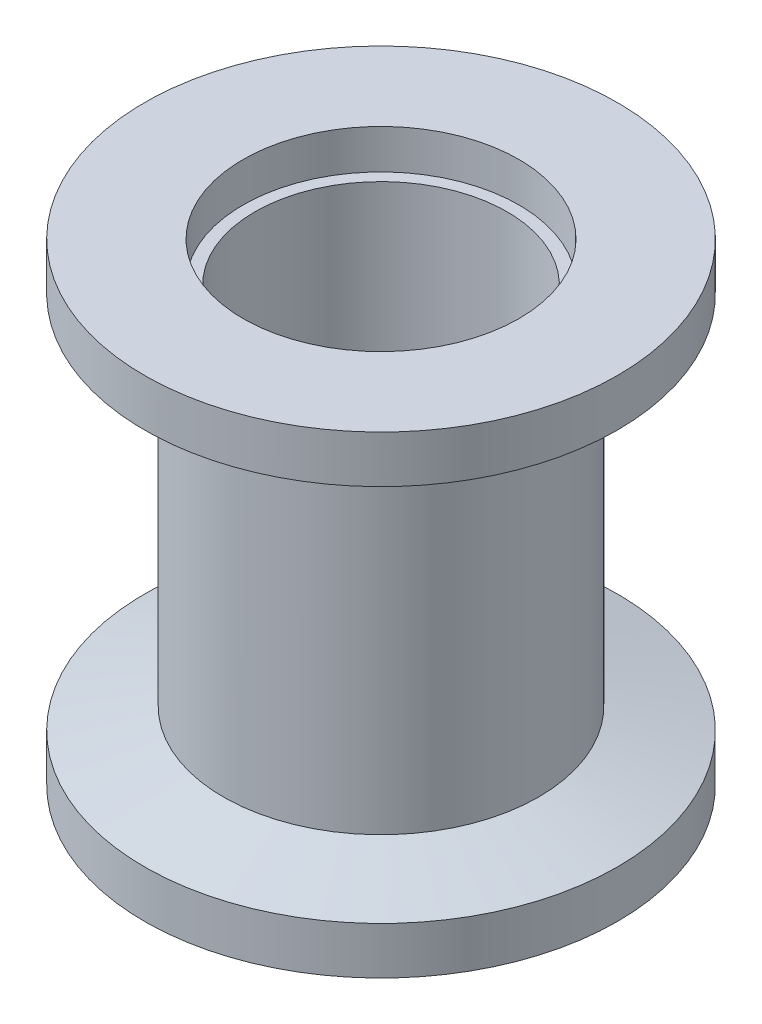
ISO-10303-21;
HEADER;
FILE_DESCRIPTION(('STEP AP214'),'2;1');
FILE_NAME('part.step','',(''),(''),'','','');
FILE_SCHEMA(('AUTOMOTIVE_DESIGN { 1 0 10303 214 1 1 1 1 }'));
ENDSEC;
DATA;
#1=APPLICATION_CONTEXT('core data for automotive mechanical design processes');
#2=APPLICATION_PROTOCOL_DEFINITION('international standard','automotive_design',2000,#1);
#3=PRODUCT_CONTEXT('',#1,'mechanical');
#4=PRODUCT('Part','Part','',(#3));
#5=PRODUCT_RELATED_PRODUCT_CATEGORY('part','',(#4));
#6=PRODUCT_DEFINITION_FORMATION('','',#4);
#7=PRODUCT_DEFINITION_CONTEXT('part definition',#1,'design');
#8=PRODUCT_DEFINITION('design','',#6,#7);
#9=PRODUCT_DEFINITION_SHAPE('','',#8);
#10=(LENGTH_UNIT() NAMED_UNIT(*) SI_UNIT(.MILLI.,.METRE.));
#11=(NAMED_UNIT(*) PLANE_ANGLE_UNIT() SI_UNIT($,.RADIAN.));
#12=(NAMED_UNIT(*) SI_UNIT($,.STERADIAN.) SOLID_ANGLE_UNIT());
#13=UNCERTAINTY_MEASURE_WITH_UNIT(LENGTH_MEASURE(1.E-05),#10,'distance_accuracy_value','');
#14=(GEOMETRIC_REPRESENTATION_CONTEXT(3) GLOBAL_UNCERTAINTY_ASSIGNED_CONTEXT((#13)) GLOBAL_UNIT_ASSIGNED_CONTEXT((#10,
#11,#12)) REPRESENTATION_CONTEXT('',''));
#15=CARTESIAN_POINT('',(0.,0.,0.));
#16=DIRECTION('',(0.,0.,1.));
#17=DIRECTION('',(1.,0.,0.));
#18=AXIS2_PLACEMENT_3D('',#15,#16,#17);
#19=CARTESIAN_POINT('',(0.,11.33012701892,0.));
#20=DIRECTION('',(0.,1.,0.));
#21=DIRECTION('',(1.,0.,0.));
#22=AXIS2_PLACEMENT_3D('',#19,#20,#21);
#23=CONICAL_SURFACE('',#22,12.5,1.30899693899575);
#24=CARTESIAN_POINT('',(0.,12.,0.));
#25=DIRECTION('',(0.,1.,0.));
#26=DIRECTION('',(1.,0.,0.));
#27=AXIS2_PLACEMENT_3D('',#24,#25,#26);
#28=CIRCLE('',#27,15.);
#29=CARTESIAN_POINT('',(-15.,12.,0.));
#30=VERTEX_POINT('',#29);
#31=CARTESIAN_POINT('',(15.,12.,0.));
#32=VERTEX_POINT('',#31);
#33=EDGE_CURVE('E119',#30,#32,#28,.T.);
#34=ORIENTED_EDGE('',*,*,#33,.F.);
#35=DIRECTION('',(0.965925826289068,-0.258819045102521,0.));
#36=VECTOR('',#35,1.);
#37=CARTESIAN_POINT('',(-12.5,11.33012701892,0.));
#38=LINE('',#37,#36);
#39=CARTESIAN_POINT('',(-10.,10.66025403784,0.));
#40=VERTEX_POINT('',#39);
#41=EDGE_CURVE('E11',#30,#40,#38,.T.);
#42=ORIENTED_EDGE('',*,*,#41,.T.);
#43=CARTESIAN_POINT('',(0.,10.66025403784,0.));
#44=DIRECTION('',(0.,-1.,0.));
#45=DIRECTION('',(1.,0.,0.));
#46=AXIS2_PLACEMENT_3D('',#43,#44,#45);
#47=CIRCLE('',#46,10.);
#48=CARTESIAN_POINT('',(10.,10.66025403784,0.));
#49=VERTEX_POINT('',#48);
#50=EDGE_CURVE('E96',#49,#40,#47,.T.);
#51=ORIENTED_EDGE('',*,*,#50,.F.);
#52=CARTESIAN_POINT('',(0.,10.66025403784,0.));
#53=DIRECTION('',(0.,-1.,0.));
#54=DIRECTION('',(1.,0.,0.));
#55=AXIS2_PLACEMENT_3D('',#52,#53,#54);
#56=CIRCLE('',#55,10.);
#57=EDGE_CURVE('E93',#40,#49,#56,.T.);
#58=ORIENTED_EDGE('',*,*,#57,.F.);
#59=ORIENTED_EDGE('',*,*,#41,.F.);
#60=CARTESIAN_POINT('',(0.,12.,0.));
#61=DIRECTION('',(0.,1.,0.));
#62=DIRECTION('',(1.,0.,0.));
#63=AXIS2_PLACEMENT_3D('',#60,#61,#62);
#64=CIRCLE('',#63,15.);
#65=EDGE_CURVE('E27',#32,#30,#64,.T.);
#66=ORIENTED_EDGE('',*,*,#65,.F.);
#67=EDGE_LOOP('',(#34,#42,#51,#58,#59,#66));
#68=FACE_BOUND('',#67,.T.);
#69=ADVANCED_FACE('F17',(#68),#23,.T.);
#70=CARTESIAN_POINT('',(0.,15.75,0.));
#71=DIRECTION('',(0.,-1.,0.));
#72=DIRECTION('',(-1.,0.,0.));
#73=AXIS2_PLACEMENT_3D('',#70,#71,#72);
#74=CYLINDRICAL_SURFACE('',#73,15.);
#75=ORIENTED_EDGE('',*,*,#33,.T.);
#76=DIRECTION('',(0.,1.,0.));
#77=VECTOR('',#76,1.);
#78=CARTESIAN_POINT('',(15.,15.75,0.));
#79=LINE('',#78,#77);
#80=CARTESIAN_POINT('',(15.,15.,0.));
#81=VERTEX_POINT('',#80);
#82=EDGE_CURVE('E123',#32,#81,#79,.T.);
#83=ORIENTED_EDGE('',*,*,#82,.T.);
#84=CARTESIAN_POINT('',(0.,15.,0.));
#85=DIRECTION('',(0.,1.,0.));
#86=DIRECTION('',(1.,0.,0.));
#87=AXIS2_PLACEMENT_3D('',#84,#85,#86);
#88=CIRCLE('',#87,15.);
#89=EDGE_CURVE('E124',#81,#81,#88,.T.);
#90=ORIENTED_EDGE('',*,*,#89,.F.);
#91=ORIENTED_EDGE('',*,*,#82,.F.);
#92=ORIENTED_EDGE('',*,*,#65,.T.);
#93=EDGE_LOOP('',(#75,#83,#90,#91,#92));
#94=FACE_BOUND('',#93,.T.);
#95=ADVANCED_FACE('F194',(#94),#74,.T.);
#96=CARTESIAN_POINT('',(0.,15.,0.));
#97=DIRECTION('',(0.,-1.,0.));
#98=DIRECTION('',(0.,0.,-1.));
#99=AXIS2_PLACEMENT_3D('',#96,#97,#98);
#100=PLANE('',#99);
#101=CARTESIAN_POINT('',(0.,15.,0.));
#102=DIRECTION('',(0.,1.,0.));
#103=DIRECTION('',(1.,0.,0.));
#104=AXIS2_PLACEMENT_3D('',#101,#102,#103);
#105=CIRCLE('',#104,8.75);
#106=CARTESIAN_POINT('',(8.75,15.,0.));
#107=VERTEX_POINT('',#106);
#108=EDGE_CURVE('E175',#107,#107,#105,.T.);
#109=ORIENTED_EDGE('',*,*,#108,.F.);
#110=EDGE_LOOP('',(#109));
#111=FACE_BOUND('',#110,.T.);
#112=ORIENTED_EDGE('',*,*,#89,.T.);
#113=EDGE_LOOP('',(#112));
#114=FACE_BOUND('',#113,.T.);
#115=ADVANCED_FACE('F191',(#111,#114),#100,.F.);
#116=CARTESIAN_POINT('',(0.,15.75,0.));
#117=DIRECTION('',(0.,-1.,0.));
#118=DIRECTION('',(-1.,0.,0.));
#119=AXIS2_PLACEMENT_3D('',#116,#117,#118);
#120=CYLINDRICAL_SURFACE('',#119,8.75);
#121=ORIENTED_EDGE('',*,*,#108,.T.);
#122=DIRECTION('',(0.,-1.,0.));
#123=VECTOR('',#122,1.);
#124=CARTESIAN_POINT('',(8.75,15.75,0.));
#125=LINE('',#124,#123);
#126=CARTESIAN_POINT('',(8.75,12.5,0.));
#127=VERTEX_POINT('',#126);
#128=EDGE_CURVE('E148',#107,#127,#125,.T.);
#129=ORIENTED_EDGE('',*,*,#128,.T.);
#130=CARTESIAN_POINT('',(0.,12.5,0.));
#131=DIRECTION('',(0.,1.,0.));
#132=DIRECTION('',(1.,0.,0.));
#133=AXIS2_PLACEMENT_3D('',#130,#131,#132);
#134=CIRCLE('',#133,8.75);
#135=EDGE_CURVE('E130',#127,#127,#134,.T.);
#136=ORIENTED_EDGE('',*,*,#135,.F.);
#137=ORIENTED_EDGE('',*,*,#128,.F.);
#138=EDGE_LOOP('',(#121,#129,#136,#137));
#139=FACE_BOUND('',#138,.T.);
#140=ADVANCED_FACE('F188',(#139),#120,.F.);
#141=CARTESIAN_POINT('',(0.,12.5,0.));
#142=DIRECTION('',(0.,-1.,0.));
#143=DIRECTION('',(0.,0.,-1.));
#144=AXIS2_PLACEMENT_3D('',#141,#142,#143);
#145=PLANE('',#144);
#146=CARTESIAN_POINT('',(0.,12.5,0.));
#147=DIRECTION('',(0.,-1.,0.));
#148=DIRECTION('',(1.,0.,0.));
#149=AXIS2_PLACEMENT_3D('',#146,#147,#148);
#150=CIRCLE('',#149,8.);
#151=CARTESIAN_POINT('',(8.,12.5,0.));
#152=VERTEX_POINT('',#151);
#153=EDGE_CURVE('E113',#152,#152,#150,.T.);
#154=ORIENTED_EDGE('',*,*,#153,.T.);
#155=EDGE_LOOP('',(#154));
#156=FACE_BOUND('',#155,.T.);
#157=ORIENTED_EDGE('',*,*,#135,.T.);
#158=EDGE_LOOP('',(#157));
#159=FACE_BOUND('',#158,.T.);
#160=ADVANCED_FACE('F185',(#156,#159),#145,.F.);
#161=CARTESIAN_POINT('',(0.,15.75,0.));
#162=DIRECTION('',(0.,-1.,0.));
#163=DIRECTION('',(-1.,0.,0.));
#164=AXIS2_PLACEMENT_3D('',#161,#162,#163);
#165=CYLINDRICAL_SURFACE('',#164,8.);
#166=ORIENTED_EDGE('',*,*,#153,.F.);
#167=DIRECTION('',(0.,-1.,0.));
#168=VECTOR('',#167,1.);
#169=CARTESIAN_POINT('',(8.,15.75,0.));
#170=LINE('',#169,#168);
#171=CARTESIAN_POINT('',(8.,-12.5,0.));
#172=VERTEX_POINT('',#171);
#173=EDGE_CURVE('E117',#152,#172,#170,.T.);
#174=ORIENTED_EDGE('',*,*,#173,.T.);
#175=CARTESIAN_POINT('',(0.,-12.5,0.));
#176=DIRECTION('',(0.,-1.,0.));
#177=DIRECTION('',(1.,0.,0.));
#178=AXIS2_PLACEMENT_3D('',#175,#176,#177);
#179=CIRCLE('',#178,8.);
#180=EDGE_CURVE('E109',#172,#172,#179,.T.);
#181=ORIENTED_EDGE('',*,*,#180,.T.);
#182=ORIENTED_EDGE('',*,*,#173,.F.);
#183=EDGE_LOOP('',(#166,#174,#181,#182));
#184=FACE_BOUND('',#183,.T.);
#185=ADVANCED_FACE('F293',(#184),#165,.F.);
#186=CARTESIAN_POINT('',(0.,-12.5,0.));
#187=DIRECTION('',(0.,-1.,0.));
#188=DIRECTION('',(0.,0.,-1.));
#189=AXIS2_PLACEMENT_3D('',#186,#187,#188);
#190=PLANE('',#189);
#191=ORIENTED_EDGE('',*,*,#180,.F.);
#192=EDGE_LOOP('',(#191));
#193=FACE_BOUND('',#192,.T.);
#194=CARTESIAN_POINT('',(0.,-12.5,0.));
#195=DIRECTION('',(0.,1.,0.));
#196=DIRECTION('',(1.,0.,0.));
#197=AXIS2_PLACEMENT_3D('',#194,#195,#196);
#198=CIRCLE('',#197,8.75);
#199=CARTESIAN_POINT('',(8.75,-12.5,0.));
#200=VERTEX_POINT('',#199);
#201=EDGE_CURVE('E127',#200,#200,#198,.T.);
#202=ORIENTED_EDGE('',*,*,#201,.F.);
#203=EDGE_LOOP('',(#202));
#204=FACE_BOUND('',#203,.T.);
#205=ADVANCED_FACE('F284',(#193,#204),#190,.T.);
#206=CARTESIAN_POINT('',(0.,-15.75,0.));
#207=DIRECTION('',(0.,-1.,0.));
#208=DIRECTION('',(-1.,0.,0.));
#209=AXIS2_PLACEMENT_3D('',#206,#207,#208);
#210=CYLINDRICAL_SURFACE('',#209,8.75);
#211=ORIENTED_EDGE('',*,*,#201,.T.);
#212=DIRECTION('',(0.,-1.,0.));
#213=VECTOR('',#212,1.);
#214=CARTESIAN_POINT('',(8.75,-15.75,0.));
#215=LINE('',#214,#213);
#216=CARTESIAN_POINT('',(8.75,-15.,0.));
#217=VERTEX_POINT('',#216);
#218=EDGE_CURVE('E114',#200,#217,#215,.T.);
#219=ORIENTED_EDGE('',*,*,#218,.T.);
#220=CARTESIAN_POINT('',(0.,-15.,0.));
#221=DIRECTION('',(0.,-1.,0.));
#222=DIRECTION('',(1.,0.,0.));
#223=AXIS2_PLACEMENT_3D('',#220,#221,#222);
#224=CIRCLE('',#223,8.75);
#225=EDGE_CURVE('E139',#217,#217,#224,.T.);
#226=ORIENTED_EDGE('',*,*,#225,.T.);
#227=ORIENTED_EDGE('',*,*,#218,.F.);
#228=EDGE_LOOP('',(#211,#219,#226,#227));
#229=FACE_BOUND('',#228,.T.);
#230=ADVANCED_FACE('F155',(#229),#210,.F.);
#231=CARTESIAN_POINT('',(0.,-15.,0.));
#232=DIRECTION('',(0.,-1.,0.));
#233=DIRECTION('',(0.,0.,-1.));
#234=AXIS2_PLACEMENT_3D('',#231,#232,#233);
#235=PLANE('',#234);
#236=ORIENTED_EDGE('',*,*,#225,.F.);
#237=EDGE_LOOP('',(#236));
#238=FACE_BOUND('',#237,.T.);
#239=CARTESIAN_POINT('',(0.,-15.,0.));
#240=DIRECTION('',(0.,1.,0.));
#241=DIRECTION('',(1.,0.,0.));
#242=AXIS2_PLACEMENT_3D('',#239,#240,#241);
#243=CIRCLE('',#242,15.);
#244=CARTESIAN_POINT('',(15.,-15.,0.));
#245=VERTEX_POINT('',#244);
#246=EDGE_CURVE('E86',#245,#245,#243,.T.);
#247=ORIENTED_EDGE('',*,*,#246,.F.);
#248=EDGE_LOOP('',(#247));
#249=FACE_BOUND('',#248,.T.);
#250=ADVANCED_FACE('F157',(#238,#249),#235,.T.);
#251=CARTESIAN_POINT('',(0.,-15.75,0.));
#252=DIRECTION('',(0.,-1.,0.));
#253=DIRECTION('',(-1.,0.,0.));
#254=AXIS2_PLACEMENT_3D('',#251,#252,#253);
#255=CYLINDRICAL_SURFACE('',#254,15.);
#256=ORIENTED_EDGE('',*,*,#246,.T.);
#257=DIRECTION('',(0.,1.,0.));
#258=VECTOR('',#257,1.);
#259=CARTESIAN_POINT('',(15.,-15.75,0.));
#260=LINE('',#259,#258);
#261=CARTESIAN_POINT('',(15.0000000000006,-11.999999999998,0.));
#262=VERTEX_POINT('',#261);
#263=EDGE_CURVE('E142',#245,#262,#260,.T.);
#264=ORIENTED_EDGE('',*,*,#263,.T.);
#265=CARTESIAN_POINT('',(0.,-12.,0.));
#266=DIRECTION('',(0.,1.,0.));
#267=DIRECTION('',(1.,0.,0.));
#268=AXIS2_PLACEMENT_3D('',#265,#266,#267);
#269=CIRCLE('',#268,15.);
#270=EDGE_CURVE('E84',#262,#262,#269,.T.);
#271=ORIENTED_EDGE('',*,*,#270,.F.);
#272=ORIENTED_EDGE('',*,*,#263,.F.);
#273=EDGE_LOOP('',(#256,#264,#271,#272));
#274=FACE_BOUND('',#273,.T.);
#275=ADVANCED_FACE('F160',(#274),#255,.T.);
#276=CARTESIAN_POINT('',(0.,-11.33012701892,0.));
#277=DIRECTION('',(0.,-1.,0.));
#278=DIRECTION('',(-1.,0.,0.));
#279=AXIS2_PLACEMENT_3D('',#276,#277,#278);
#280=CONICAL_SURFACE('',#279,12.5,1.30899693899575);
#281=ORIENTED_EDGE('',*,*,#270,.T.);
#282=DIRECTION('',(-0.965925826289068,0.258819045102521,0.));
#283=VECTOR('',#282,1.);
#284=CARTESIAN_POINT('',(12.5,-11.33012701892,0.));
#285=LINE('',#284,#283);
#286=CARTESIAN_POINT('',(10.,-10.66025403784,0.));
#287=VERTEX_POINT('',#286);
#288=EDGE_CURVE('E78',#262,#287,#285,.T.);
#289=ORIENTED_EDGE('',*,*,#288,.T.);
#290=CARTESIAN_POINT('',(0.,-10.66025403784,0.));
#291=DIRECTION('',(0.,1.,0.));
#292=DIRECTION('',(1.,0.,0.));
#293=AXIS2_PLACEMENT_3D('',#290,#291,#292);
#294=CIRCLE('',#293,10.);
#295=EDGE_CURVE('E82',#287,#287,#294,.T.);
#296=ORIENTED_EDGE('',*,*,#295,.F.);
#297=ORIENTED_EDGE('',*,*,#288,.F.);
#298=EDGE_LOOP('',(#281,#289,#296,#297));
#299=FACE_BOUND('',#298,.T.);
#300=ADVANCED_FACE('F80',(#299),#280,.T.);
#301=CARTESIAN_POINT('',(0.,15.75,0.));
#302=DIRECTION('',(0.,-1.,0.));
#303=DIRECTION('',(-1.,0.,0.));
#304=AXIS2_PLACEMENT_3D('',#301,#302,#303);
#305=CYLINDRICAL_SURFACE('',#304,10.);
#306=ORIENTED_EDGE('',*,*,#295,.T.);
#307=DIRECTION('',(0.,1.,0.));
#308=VECTOR('',#307,1.);
#309=CARTESIAN_POINT('',(10.,15.75,0.));
#310=LINE('',#309,#308);
#311=EDGE_CURVE('E20',#287,#49,#310,.T.);
#312=ORIENTED_EDGE('',*,*,#311,.T.);
#313=ORIENTED_EDGE('',*,*,#50,.T.);
#314=ORIENTED_EDGE('',*,*,#57,.T.);
#315=ORIENTED_EDGE('',*,*,#311,.F.);
#316=EDGE_LOOP('',(#306,#312,#313,#314,#315));
#317=FACE_BOUND('',#316,.T.);
#318=ADVANCED_FACE('F90',(#317),#305,.T.);
#319=CLOSED_SHELL('',(#69,#95,#115,#140,#160,#185,#205,#230,#250,#275,#300,#318));
#320=MANIFOLD_SOLID_BREP('B1',#319);
#321=ADVANCED_BREP_SHAPE_REPRESENTATION('',(#18,#320),#14);
#322=SHAPE_DEFINITION_REPRESENTATION(#9,#321);
ENDSEC;
END-ISO-10303-21;
